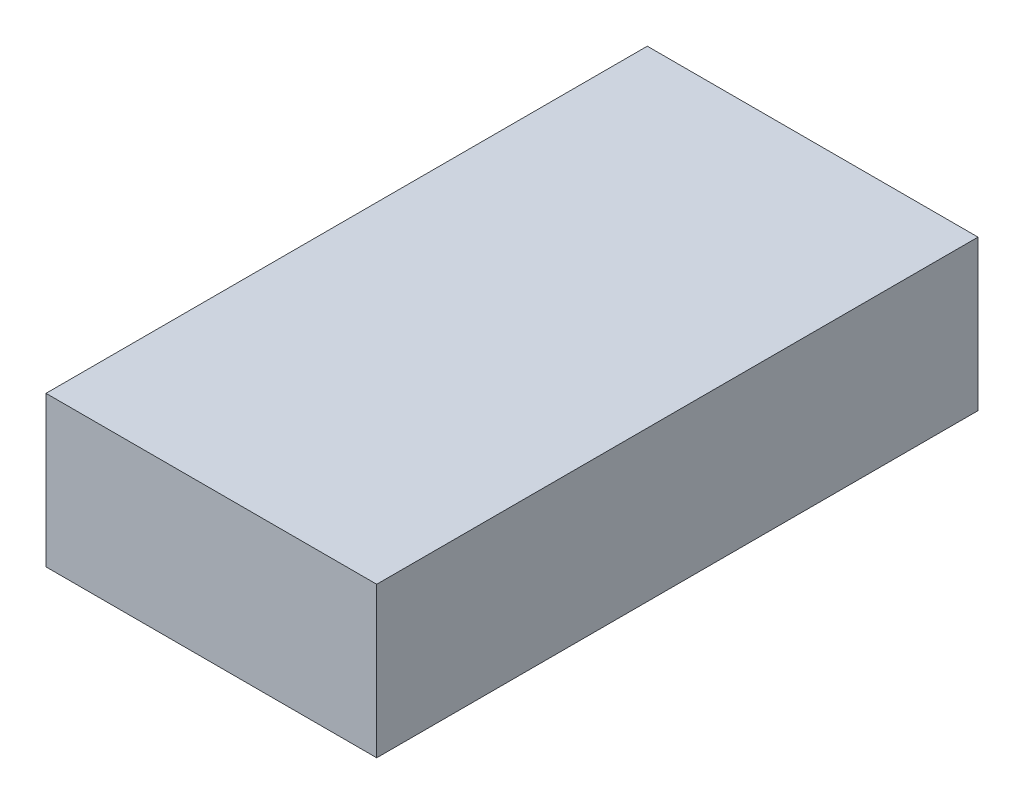
ISO-10303-21;
HEADER;
FILE_DESCRIPTION(('STEP AP214'),'2;1');
FILE_NAME('part.step','',(''),(''),'','','');
FILE_SCHEMA(('AUTOMOTIVE_DESIGN { 1 0 10303 214 1 1 1 1 }'));
ENDSEC;
DATA;
#1=APPLICATION_CONTEXT('core data for automotive mechanical design processes');
#2=APPLICATION_PROTOCOL_DEFINITION('international standard','automotive_design',2000,#1);
#3=PRODUCT_CONTEXT('',#1,'mechanical');
#4=PRODUCT('Part','Part','',(#3));
#5=PRODUCT_RELATED_PRODUCT_CATEGORY('part','',(#4));
#6=PRODUCT_DEFINITION_FORMATION('','',#4);
#7=PRODUCT_DEFINITION_CONTEXT('part definition',#1,'design');
#8=PRODUCT_DEFINITION('design','',#6,#7);
#9=PRODUCT_DEFINITION_SHAPE('','',#8);
#10=(LENGTH_UNIT() NAMED_UNIT(*) SI_UNIT(.MILLI.,.METRE.));
#11=(NAMED_UNIT(*) PLANE_ANGLE_UNIT() SI_UNIT($,.RADIAN.));
#12=(NAMED_UNIT(*) SI_UNIT($,.STERADIAN.) SOLID_ANGLE_UNIT());
#13=UNCERTAINTY_MEASURE_WITH_UNIT(LENGTH_MEASURE(1.E-05),#10,'distance_accuracy_value','');
#14=(GEOMETRIC_REPRESENTATION_CONTEXT(3) GLOBAL_UNCERTAINTY_ASSIGNED_CONTEXT((#13)) GLOBAL_UNIT_ASSIGNED_CONTEXT((#10,
#11,#12)) REPRESENTATION_CONTEXT('',''));
#15=CARTESIAN_POINT('',(0.,0.,0.));
#16=DIRECTION('',(0.,0.,1.));
#17=DIRECTION('',(1.,0.,0.));
#18=AXIS2_PLACEMENT_3D('',#15,#16,#17);
#19=CARTESIAN_POINT('',(0.,0.,200.));
#20=DIRECTION('',(1.,0.,0.));
#21=DIRECTION('',(0.,0.,-1.));
#22=AXIS2_PLACEMENT_3D('',#19,#20,#21);
#23=PLANE('',#22);
#24=DIRECTION('',(0.,-1.,0.));
#25=VECTOR('',#24,1.);
#26=CARTESIAN_POINT('',(0.,0.,0.));
#27=LINE('',#26,#25);
#28=CARTESIAN_POINT('',(0.,50.,0.));
#29=VERTEX_POINT('',#28);
#30=CARTESIAN_POINT('',(0.,0.,0.));
#31=VERTEX_POINT('',#30);
#32=EDGE_CURVE('E105',#29,#31,#27,.T.);
#33=ORIENTED_EDGE('',*,*,#32,.T.);
#34=DIRECTION('',(0.,0.,-1.));
#35=VECTOR('',#34,1.);
#36=CARTESIAN_POINT('',(0.,0.,200.));
#37=LINE('',#36,#35);
#38=CARTESIAN_POINT('',(0.,0.,200.));
#39=VERTEX_POINT('',#38);
#40=EDGE_CURVE('E11',#39,#31,#37,.T.);
#41=ORIENTED_EDGE('',*,*,#40,.F.);
#42=DIRECTION('',(0.,-1.,0.));
#43=VECTOR('',#42,1.);
#44=CARTESIAN_POINT('',(0.,0.,200.));
#45=LINE('',#44,#43);
#46=CARTESIAN_POINT('',(0.,50.,200.));
#47=VERTEX_POINT('',#46);
#48=EDGE_CURVE('E93',#47,#39,#45,.T.);
#49=ORIENTED_EDGE('',*,*,#48,.F.);
#50=DIRECTION('',(0.,0.,-1.));
#51=VECTOR('',#50,1.);
#52=CARTESIAN_POINT('',(0.,50.,200.));
#53=LINE('',#52,#51);
#54=EDGE_CURVE('E101',#47,#29,#53,.T.);
#55=ORIENTED_EDGE('',*,*,#54,.T.);
#56=EDGE_LOOP('',(#33,#41,#49,#55));
#57=FACE_BOUND('',#56,.T.);
#58=ADVANCED_FACE('F42',(#57),#23,.F.);
#59=CARTESIAN_POINT('',(0.,0.,200.));
#60=DIRECTION('',(0.,1.,0.));
#61=DIRECTION('',(0.,0.,1.));
#62=AXIS2_PLACEMENT_3D('',#59,#60,#61);
#63=PLANE('',#62);
#64=DIRECTION('',(1.,0.,0.));
#65=VECTOR('',#64,1.);
#66=CARTESIAN_POINT('',(0.,0.,0.));
#67=LINE('',#66,#65);
#68=CARTESIAN_POINT('',(110.,0.,0.));
#69=VERTEX_POINT('',#68);
#70=EDGE_CURVE('E97',#31,#69,#67,.T.);
#71=ORIENTED_EDGE('',*,*,#70,.T.);
#72=DIRECTION('',(0.,0.,-1.));
#73=VECTOR('',#72,1.);
#74=CARTESIAN_POINT('',(110.,0.,200.));
#75=LINE('',#74,#73);
#76=CARTESIAN_POINT('',(110.,0.,200.));
#77=VERTEX_POINT('',#76);
#78=EDGE_CURVE('E50',#77,#69,#75,.T.);
#79=ORIENTED_EDGE('',*,*,#78,.F.);
#80=DIRECTION('',(1.,0.,0.));
#81=VECTOR('',#80,1.);
#82=CARTESIAN_POINT('',(0.,0.,200.));
#83=LINE('',#82,#81);
#84=EDGE_CURVE('E88',#39,#77,#83,.T.);
#85=ORIENTED_EDGE('',*,*,#84,.F.);
#86=ORIENTED_EDGE('',*,*,#40,.T.);
#87=EDGE_LOOP('',(#71,#79,#85,#86));
#88=FACE_BOUND('',#87,.T.);
#89=ADVANCED_FACE('F96',(#88),#63,.F.);
#90=CARTESIAN_POINT('',(110.,50.,200.));
#91=DIRECTION('',(-1.,0.,0.));
#92=DIRECTION('',(0.,0.,1.));
#93=AXIS2_PLACEMENT_3D('',#90,#91,#92);
#94=PLANE('',#93);
#95=DIRECTION('',(0.,1.,0.));
#96=VECTOR('',#95,1.);
#97=CARTESIAN_POINT('',(110.,50.,0.));
#98=LINE('',#97,#96);
#99=CARTESIAN_POINT('',(110.,50.,0.));
#100=VERTEX_POINT('',#99);
#101=EDGE_CURVE('E75',#69,#100,#98,.T.);
#102=ORIENTED_EDGE('',*,*,#101,.T.);
#103=DIRECTION('',(0.,0.,-1.));
#104=VECTOR('',#103,1.);
#105=CARTESIAN_POINT('',(110.,50.,200.));
#106=LINE('',#105,#104);
#107=CARTESIAN_POINT('',(110.,50.,200.));
#108=VERTEX_POINT('',#107);
#109=EDGE_CURVE('E98',#108,#100,#106,.T.);
#110=ORIENTED_EDGE('',*,*,#109,.F.);
#111=DIRECTION('',(0.,1.,0.));
#112=VECTOR('',#111,1.);
#113=CARTESIAN_POINT('',(110.,50.,200.));
#114=LINE('',#113,#112);
#115=EDGE_CURVE('E91',#77,#108,#114,.T.);
#116=ORIENTED_EDGE('',*,*,#115,.F.);
#117=ORIENTED_EDGE('',*,*,#78,.T.);
#118=EDGE_LOOP('',(#102,#110,#116,#117));
#119=FACE_BOUND('',#118,.T.);
#120=ADVANCED_FACE('F99',(#119),#94,.F.);
#121=CARTESIAN_POINT('',(0.,50.,200.));
#122=DIRECTION('',(0.,-1.,0.));
#123=DIRECTION('',(0.,0.,-1.));
#124=AXIS2_PLACEMENT_3D('',#121,#122,#123);
#125=PLANE('',#124);
#126=DIRECTION('',(-1.,0.,0.));
#127=VECTOR('',#126,1.);
#128=CARTESIAN_POINT('',(0.,50.,0.));
#129=LINE('',#128,#127);
#130=EDGE_CURVE('E81',#100,#29,#129,.T.);
#131=ORIENTED_EDGE('',*,*,#130,.T.);
#132=ORIENTED_EDGE('',*,*,#54,.F.);
#133=DIRECTION('',(-1.,0.,0.));
#134=VECTOR('',#133,1.);
#135=CARTESIAN_POINT('',(0.,50.,200.));
#136=LINE('',#135,#134);
#137=EDGE_CURVE('E58',#108,#47,#136,.T.);
#138=ORIENTED_EDGE('',*,*,#137,.F.);
#139=ORIENTED_EDGE('',*,*,#109,.T.);
#140=EDGE_LOOP('',(#131,#132,#138,#139));
#141=FACE_BOUND('',#140,.T.);
#142=ADVANCED_FACE('F112',(#141),#125,.F.);
#143=CARTESIAN_POINT('',(0.,0.,200.));
#144=DIRECTION('',(0.,0.,-1.));
#145=DIRECTION('',(-1.,0.,0.));
#146=AXIS2_PLACEMENT_3D('',#143,#144,#145);
#147=PLANE('',#146);
#148=ORIENTED_EDGE('',*,*,#48,.T.);
#149=ORIENTED_EDGE('',*,*,#84,.T.);
#150=ORIENTED_EDGE('',*,*,#115,.T.);
#151=ORIENTED_EDGE('',*,*,#137,.T.);
#152=EDGE_LOOP('',(#148,#149,#150,#151));
#153=FACE_BOUND('',#152,.T.);
#154=ADVANCED_FACE('F89',(#153),#147,.F.);
#155=CARTESIAN_POINT('',(0.,0.,0.));
#156=DIRECTION('',(0.,0.,-1.));
#157=DIRECTION('',(-1.,0.,0.));
#158=AXIS2_PLACEMENT_3D('',#155,#156,#157);
#159=PLANE('',#158);
#160=ORIENTED_EDGE('',*,*,#32,.F.);
#161=ORIENTED_EDGE('',*,*,#130,.F.);
#162=ORIENTED_EDGE('',*,*,#101,.F.);
#163=ORIENTED_EDGE('',*,*,#70,.F.);
#164=EDGE_LOOP('',(#160,#161,#162,#163));
#165=FACE_BOUND('',#164,.T.);
#166=ADVANCED_FACE('F115',(#165),#159,.T.);
#167=CLOSED_SHELL('',(#58,#89,#120,#142,#154,#166));
#168=MANIFOLD_SOLID_BREP('B2',#167);
#169=ADVANCED_BREP_SHAPE_REPRESENTATION('',(#18,#168),#14);
#170=SHAPE_DEFINITION_REPRESENTATION(#9,#169);
ENDSEC;
END-ISO-10303-21;
